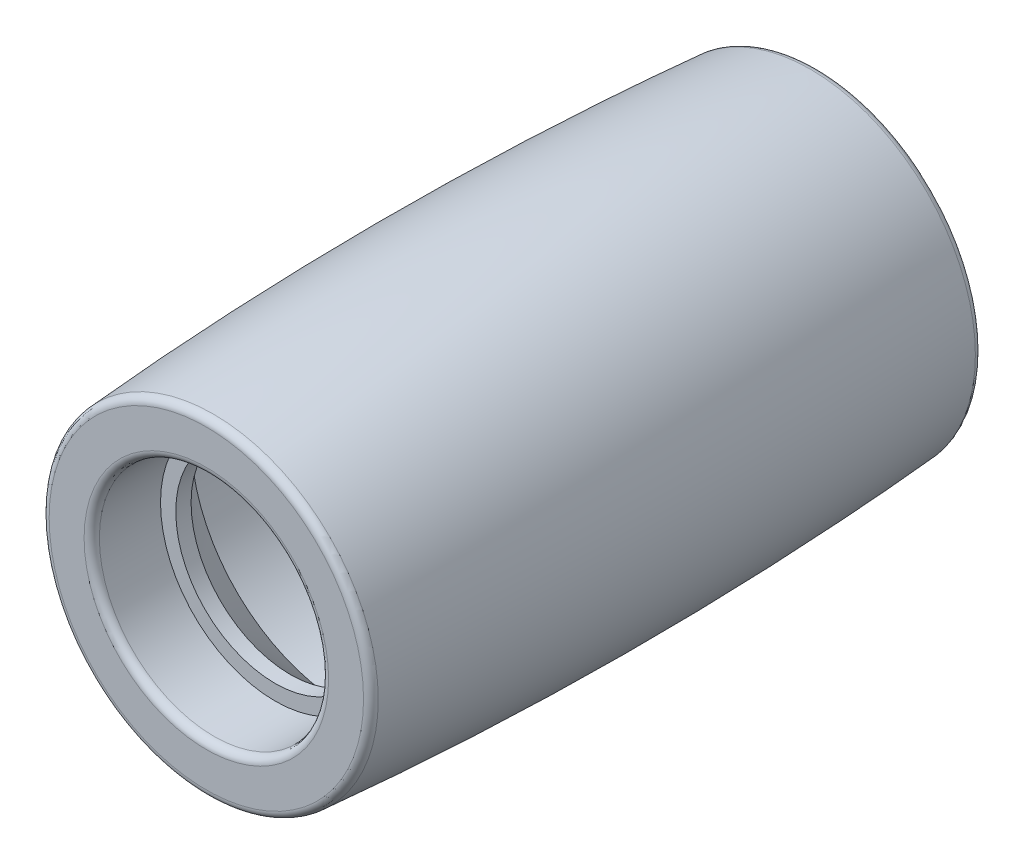
ISO-10303-21;
HEADER;
FILE_DESCRIPTION(('STEP AP214'),'2;1');
FILE_NAME('part.step','',(''),(''),'','','');
FILE_SCHEMA(('AUTOMOTIVE_DESIGN { 1 0 10303 214 1 1 1 1 }'));
ENDSEC;
DATA;
#1=APPLICATION_CONTEXT('core data for automotive mechanical design processes');
#2=APPLICATION_PROTOCOL_DEFINITION('international standard','automotive_design',2000,#1);
#3=PRODUCT_CONTEXT('',#1,'mechanical');
#4=PRODUCT('Part','Part','',(#3));
#5=PRODUCT_RELATED_PRODUCT_CATEGORY('part','',(#4));
#6=PRODUCT_DEFINITION_FORMATION('','',#4);
#7=PRODUCT_DEFINITION_CONTEXT('part definition',#1,'design');
#8=PRODUCT_DEFINITION('design','',#6,#7);
#9=PRODUCT_DEFINITION_SHAPE('','',#8);
#10=(LENGTH_UNIT() NAMED_UNIT(*) SI_UNIT(.MILLI.,.METRE.));
#11=(NAMED_UNIT(*) PLANE_ANGLE_UNIT() SI_UNIT($,.RADIAN.));
#12=(NAMED_UNIT(*) SI_UNIT($,.STERADIAN.) SOLID_ANGLE_UNIT());
#13=UNCERTAINTY_MEASURE_WITH_UNIT(LENGTH_MEASURE(1.E-05),#10,'distance_accuracy_value','');
#14=(GEOMETRIC_REPRESENTATION_CONTEXT(3) GLOBAL_UNCERTAINTY_ASSIGNED_CONTEXT((#13)) GLOBAL_UNIT_ASSIGNED_CONTEXT((#10,
#11,#12)) REPRESENTATION_CONTEXT('',''));
#15=CARTESIAN_POINT('',(0.,0.,0.));
#16=DIRECTION('',(0.,0.,1.));
#17=DIRECTION('',(1.,0.,0.));
#18=AXIS2_PLACEMENT_3D('',#15,#16,#17);
#19=CARTESIAN_POINT('',(450.,0.,-49.5));
#20=DIRECTION('',(0.,0.,1.));
#21=DIRECTION('',(1.,0.,0.));
#22=AXIS2_PLACEMENT_3D('',#19,#20,#21);
#23=DEGENERATE_TOROIDAL_SURFACE('',#22,511.083333333333,534.083333333333,.F.);
#24=CARTESIAN_POINT('',(450.,0.,-10.4268407065812));
#25=DIRECTION('',(0.,0.,-1.));
#26=DIRECTION('',(-1.,0.,0.));
#27=AXIS2_PLACEMENT_3D('',#24,#25,#26);
#28=CIRCLE('',#27,21.5688000213315);
#29=CARTESIAN_POINT('',(428.431199978669,0.,-10.4268407065812));
#30=VERTEX_POINT('',#29);
#31=EDGE_CURVE('E61',#30,#30,#28,.T.);
#32=ORIENTED_EDGE('',*,*,#31,.T.);
#33=EDGE_LOOP('',(#32));
#34=FACE_BOUND('',#33,.T.);
#35=CARTESIAN_POINT('',(450.,0.,-88.5731592934189));
#36=DIRECTION('',(0.,0.,1.));
#37=DIRECTION('',(1.,0.,0.));
#38=AXIS2_PLACEMENT_3D('',#35,#36,#37);
#39=CIRCLE('',#38,21.5688000213314);
#40=CARTESIAN_POINT('',(471.568800021331,0.,-88.5731592934189));
#41=VERTEX_POINT('',#40);
#42=EDGE_CURVE('E64',#41,#41,#39,.T.);
#43=ORIENTED_EDGE('',*,*,#42,.T.);
#44=EDGE_LOOP('',(#43));
#45=FACE_BOUND('',#44,.T.);
#46=ADVANCED_FACE('F41',(#34,#45),#23,.F.);
#47=CARTESIAN_POINT('',(450.,21.5,-9.49999999999999));
#48=DIRECTION('',(0.,0.,-1.));
#49=DIRECTION('',(-1.,0.,0.));
#50=AXIS2_PLACEMENT_3D('',#47,#48,#49);
#51=PLANE('',#50);
#52=CARTESIAN_POINT('',(450.,0.,-9.49999999999999));
#53=DIRECTION('',(0.,0.,-1.));
#54=DIRECTION('',(-1.,0.,0.));
#55=AXIS2_PLACEMENT_3D('',#52,#53,#54);
#56=CIRCLE('',#55,20.5714797529188);
#57=CARTESIAN_POINT('',(429.428520247081,0.,-9.49999999999999));
#58=VERTEX_POINT('',#57);
#59=EDGE_CURVE('E67',#58,#58,#56,.F.);
#60=ORIENTED_EDGE('',*,*,#59,.T.);
#61=EDGE_LOOP('',(#60));
#62=FACE_BOUND('',#61,.T.);
#63=CARTESIAN_POINT('',(450.,0.,-9.49999999999999));
#64=DIRECTION('',(0.,0.,-1.));
#65=DIRECTION('',(-1.,0.,0.));
#66=AXIS2_PLACEMENT_3D('',#63,#64,#65);
#67=CIRCLE('',#66,16.);
#68=CARTESIAN_POINT('',(434.,0.,-9.49999999999999));
#69=VERTEX_POINT('',#68);
#70=EDGE_CURVE('E70',#69,#69,#67,.T.);
#71=ORIENTED_EDGE('',*,*,#70,.T.);
#72=EDGE_LOOP('',(#71));
#73=FACE_BOUND('',#72,.T.);
#74=ADVANCED_FACE('F122',(#62,#73),#51,.F.);
#75=CARTESIAN_POINT('',(450.,0.,0.));
#76=DIRECTION('',(0.,0.,1.));
#77=DIRECTION('',(1.,0.,0.));
#78=AXIS2_PLACEMENT_3D('',#75,#76,#77);
#79=CYLINDRICAL_SURFACE('',#78,15.);
#80=CARTESIAN_POINT('',(450.,0.,-10.5));
#81=DIRECTION('',(0.,0.,-1.));
#82=DIRECTION('',(-1.,0.,0.));
#83=AXIS2_PLACEMENT_3D('',#80,#81,#82);
#84=CIRCLE('',#83,15.);
#85=CARTESIAN_POINT('',(435.,0.,-10.5));
#86=VERTEX_POINT('',#85);
#87=EDGE_CURVE('E56',#86,#86,#84,.F.);
#88=ORIENTED_EDGE('',*,*,#87,.T.);
#89=EDGE_LOOP('',(#88));
#90=FACE_BOUND('',#89,.T.);
#91=CARTESIAN_POINT('',(450.,0.,-18.5));
#92=DIRECTION('',(0.,0.,1.));
#93=DIRECTION('',(1.,0.,0.));
#94=AXIS2_PLACEMENT_3D('',#91,#92,#93);
#95=CIRCLE('',#94,15.);
#96=CARTESIAN_POINT('',(465.,0.,-18.5));
#97=VERTEX_POINT('',#96);
#98=EDGE_CURVE('E73',#97,#97,#95,.T.);
#99=ORIENTED_EDGE('',*,*,#98,.F.);
#100=EDGE_LOOP('',(#99));
#101=FACE_BOUND('',#100,.T.);
#102=ADVANCED_FACE('F127',(#90,#101),#79,.F.);
#103=CARTESIAN_POINT('',(450.,15.,-18.5));
#104=DIRECTION('',(0.,0.,-1.));
#105=DIRECTION('',(-1.,0.,0.));
#106=AXIS2_PLACEMENT_3D('',#103,#104,#105);
#107=PLANE('',#106);
#108=CARTESIAN_POINT('',(450.,0.,-18.5));
#109=DIRECTION('',(0.,0.,1.));
#110=DIRECTION('',(1.,0.,0.));
#111=AXIS2_PLACEMENT_3D('',#108,#109,#110);
#112=CIRCLE('',#111,13.);
#113=CARTESIAN_POINT('',(463.,0.,-18.5));
#114=VERTEX_POINT('',#113);
#115=EDGE_CURVE('E77',#114,#114,#112,.T.);
#116=ORIENTED_EDGE('',*,*,#115,.F.);
#117=EDGE_LOOP('',(#116));
#118=FACE_BOUND('',#117,.T.);
#119=ORIENTED_EDGE('',*,*,#98,.T.);
#120=EDGE_LOOP('',(#119));
#121=FACE_BOUND('',#120,.T.);
#122=ADVANCED_FACE('F242',(#118,#121),#107,.F.);
#123=CARTESIAN_POINT('',(450.,0.,0.));
#124=DIRECTION('',(0.,0.,1.));
#125=DIRECTION('',(1.,0.,0.));
#126=AXIS2_PLACEMENT_3D('',#123,#124,#125);
#127=CYLINDRICAL_SURFACE('',#126,13.);
#128=CARTESIAN_POINT('',(450.,0.,-20.5));
#129=DIRECTION('',(0.,0.,1.));
#130=DIRECTION('',(1.,0.,0.));
#131=AXIS2_PLACEMENT_3D('',#128,#129,#130);
#132=CIRCLE('',#131,13.);
#133=CARTESIAN_POINT('',(463.,0.,-20.5));
#134=VERTEX_POINT('',#133);
#135=EDGE_CURVE('E81',#134,#134,#132,.T.);
#136=ORIENTED_EDGE('',*,*,#135,.F.);
#137=EDGE_LOOP('',(#136));
#138=FACE_BOUND('',#137,.T.);
#139=ORIENTED_EDGE('',*,*,#115,.T.);
#140=EDGE_LOOP('',(#139));
#141=FACE_BOUND('',#140,.T.);
#142=ADVANCED_FACE('F118',(#138,#141),#127,.F.);
#143=CARTESIAN_POINT('',(450.,0.,-20.5));
#144=DIRECTION('',(0.,0.,-1.));
#145=DIRECTION('',(-1.,0.,0.));
#146=AXIS2_PLACEMENT_3D('',#143,#144,#145);
#147=CONICAL_SURFACE('',#146,13.,0.78539816339745);
#148=CARTESIAN_POINT('',(450.,0.,-27.712088496298));
#149=DIRECTION('',(0.,0.,1.));
#150=DIRECTION('',(1.,0.,0.));
#151=AXIS2_PLACEMENT_3D('',#148,#149,#150);
#152=CIRCLE('',#151,20.212088496298);
#153=CARTESIAN_POINT('',(470.212088496298,0.,-27.712088496298));
#154=VERTEX_POINT('',#153);
#155=EDGE_CURVE('E85',#154,#154,#152,.T.);
#156=ORIENTED_EDGE('',*,*,#155,.F.);
#157=EDGE_LOOP('',(#156));
#158=FACE_BOUND('',#157,.T.);
#159=ORIENTED_EDGE('',*,*,#135,.T.);
#160=EDGE_LOOP('',(#159));
#161=FACE_BOUND('',#160,.T.);
#162=ADVANCED_FACE('F107',(#158,#161),#147,.F.);
#163=CARTESIAN_POINT('',(450.,0.,0.));
#164=DIRECTION('',(0.,0.,1.));
#165=DIRECTION('',(1.,0.,0.));
#166=AXIS2_PLACEMENT_3D('',#163,#164,#165);
#167=CYLINDRICAL_SURFACE('',#166,20.212088496298);
#168=ORIENTED_EDGE('',*,*,#155,.T.);
#169=EDGE_LOOP('',(#168));
#170=FACE_BOUND('',#169,.T.);
#171=CARTESIAN_POINT('',(450.,0.,-71.2879115037021));
#172=DIRECTION('',(0.,0.,1.));
#173=DIRECTION('',(1.,0.,0.));
#174=AXIS2_PLACEMENT_3D('',#171,#172,#173);
#175=CIRCLE('',#174,20.212088496298);
#176=CARTESIAN_POINT('',(470.212088496298,0.,-71.2879115037021));
#177=VERTEX_POINT('',#176);
#178=EDGE_CURVE('E97',#177,#177,#175,.T.);
#179=ORIENTED_EDGE('',*,*,#178,.F.);
#180=EDGE_LOOP('',(#179));
#181=FACE_BOUND('',#180,.T.);
#182=ADVANCED_FACE('F104',(#170,#181),#167,.F.);
#183=CARTESIAN_POINT('',(450.,21.5,-89.5000000000001));
#184=DIRECTION('',(0.,0.,1.));
#185=DIRECTION('',(-1.,0.,0.));
#186=AXIS2_PLACEMENT_3D('',#183,#184,#185);
#187=PLANE('',#186);
#188=CARTESIAN_POINT('',(450.,0.,-89.5000000000001));
#189=DIRECTION('',(0.,0.,1.));
#190=DIRECTION('',(1.,0.,0.));
#191=AXIS2_PLACEMENT_3D('',#188,#189,#190);
#192=CIRCLE('',#191,20.5714797529188);
#193=CARTESIAN_POINT('',(470.571479752919,0.,-89.5000000000001));
#194=VERTEX_POINT('',#193);
#195=EDGE_CURVE('E48',#194,#194,#192,.F.);
#196=ORIENTED_EDGE('',*,*,#195,.T.);
#197=EDGE_LOOP('',(#196));
#198=FACE_BOUND('',#197,.T.);
#199=CARTESIAN_POINT('',(450.,0.,-89.5000000000001));
#200=DIRECTION('',(0.,0.,1.));
#201=DIRECTION('',(1.,0.,0.));
#202=AXIS2_PLACEMENT_3D('',#199,#200,#201);
#203=CIRCLE('',#202,16.);
#204=CARTESIAN_POINT('',(466.,0.,-89.5000000000001));
#205=VERTEX_POINT('',#204);
#206=EDGE_CURVE('E52',#205,#205,#203,.T.);
#207=ORIENTED_EDGE('',*,*,#206,.T.);
#208=EDGE_LOOP('',(#207));
#209=FACE_BOUND('',#208,.T.);
#210=ADVANCED_FACE('F106',(#198,#209),#187,.F.);
#211=CARTESIAN_POINT('',(450.,0.,-99.0000000000001));
#212=DIRECTION('',(0.,0.,-1.));
#213=DIRECTION('',(1.,0.,0.));
#214=AXIS2_PLACEMENT_3D('',#211,#212,#213);
#215=CYLINDRICAL_SURFACE('',#214,15.);
#216=CARTESIAN_POINT('',(450.,0.,-88.5000000000001));
#217=DIRECTION('',(0.,0.,1.));
#218=DIRECTION('',(1.,0.,0.));
#219=AXIS2_PLACEMENT_3D('',#216,#217,#218);
#220=CIRCLE('',#219,15.);
#221=CARTESIAN_POINT('',(465.,0.,-88.5000000000001));
#222=VERTEX_POINT('',#221);
#223=EDGE_CURVE('E10',#222,#222,#220,.F.);
#224=ORIENTED_EDGE('',*,*,#223,.T.);
#225=EDGE_LOOP('',(#224));
#226=FACE_BOUND('',#225,.T.);
#227=CARTESIAN_POINT('',(450.,0.,-80.5000000000001));
#228=DIRECTION('',(0.,0.,1.));
#229=DIRECTION('',(1.,0.,0.));
#230=AXIS2_PLACEMENT_3D('',#227,#228,#229);
#231=CIRCLE('',#230,15.);
#232=CARTESIAN_POINT('',(465.,0.,-80.5000000000001));
#233=VERTEX_POINT('',#232);
#234=EDGE_CURVE('E88',#233,#233,#231,.T.);
#235=ORIENTED_EDGE('',*,*,#234,.T.);
#236=EDGE_LOOP('',(#235));
#237=FACE_BOUND('',#236,.T.);
#238=ADVANCED_FACE('F115',(#226,#237),#215,.F.);
#239=CARTESIAN_POINT('',(450.,15.,-80.5000000000001));
#240=DIRECTION('',(0.,0.,1.));
#241=DIRECTION('',(-1.,0.,0.));
#242=AXIS2_PLACEMENT_3D('',#239,#240,#241);
#243=PLANE('',#242);
#244=CARTESIAN_POINT('',(450.,0.,-80.5000000000001));
#245=DIRECTION('',(0.,0.,1.));
#246=DIRECTION('',(1.,0.,0.));
#247=AXIS2_PLACEMENT_3D('',#244,#245,#246);
#248=CIRCLE('',#247,13.);
#249=CARTESIAN_POINT('',(463.,0.,-80.5000000000001));
#250=VERTEX_POINT('',#249);
#251=EDGE_CURVE('E91',#250,#250,#248,.T.);
#252=ORIENTED_EDGE('',*,*,#251,.T.);
#253=EDGE_LOOP('',(#252));
#254=FACE_BOUND('',#253,.T.);
#255=ORIENTED_EDGE('',*,*,#234,.F.);
#256=EDGE_LOOP('',(#255));
#257=FACE_BOUND('',#256,.T.);
#258=ADVANCED_FACE('F190',(#254,#257),#243,.F.);
#259=CARTESIAN_POINT('',(450.,0.,-99.0000000000001));
#260=DIRECTION('',(0.,0.,-1.));
#261=DIRECTION('',(1.,0.,0.));
#262=AXIS2_PLACEMENT_3D('',#259,#260,#261);
#263=CYLINDRICAL_SURFACE('',#262,13.);
#264=CARTESIAN_POINT('',(450.,0.,-78.5000000000001));
#265=DIRECTION('',(0.,0.,1.));
#266=DIRECTION('',(1.,0.,0.));
#267=AXIS2_PLACEMENT_3D('',#264,#265,#266);
#268=CIRCLE('',#267,13.);
#269=CARTESIAN_POINT('',(463.,0.,-78.5000000000001));
#270=VERTEX_POINT('',#269);
#271=EDGE_CURVE('E94',#270,#270,#268,.T.);
#272=ORIENTED_EDGE('',*,*,#271,.T.);
#273=EDGE_LOOP('',(#272));
#274=FACE_BOUND('',#273,.T.);
#275=ORIENTED_EDGE('',*,*,#251,.F.);
#276=EDGE_LOOP('',(#275));
#277=FACE_BOUND('',#276,.T.);
#278=ADVANCED_FACE('F181',(#274,#277),#263,.F.);
#279=CARTESIAN_POINT('',(450.,0.,-78.5000000000001));
#280=DIRECTION('',(0.,0.,1.));
#281=DIRECTION('',(-1.,0.,0.));
#282=AXIS2_PLACEMENT_3D('',#279,#280,#281);
#283=CONICAL_SURFACE('',#282,13.,0.78539816339745);
#284=ORIENTED_EDGE('',*,*,#178,.T.);
#285=EDGE_LOOP('',(#284));
#286=FACE_BOUND('',#285,.T.);
#287=ORIENTED_EDGE('',*,*,#271,.F.);
#288=EDGE_LOOP('',(#287));
#289=FACE_BOUND('',#288,.T.);
#290=ADVANCED_FACE('F101',(#286,#289),#283,.F.);
#291=CARTESIAN_POINT('',(450.,0.,-10.5));
#292=DIRECTION('',(0.,0.,-1.));
#293=DIRECTION('',(-1.,0.,0.));
#294=AXIS2_PLACEMENT_3D('',#291,#292,#293);
#295=TOROIDAL_SURFACE('',#294,20.5714797529188,1.);
#296=ORIENTED_EDGE('',*,*,#31,.F.);
#297=EDGE_LOOP('',(#296));
#298=FACE_BOUND('',#297,.T.);
#299=ORIENTED_EDGE('',*,*,#59,.F.);
#300=EDGE_LOOP('',(#299));
#301=FACE_BOUND('',#300,.T.);
#302=ADVANCED_FACE('F133',(#298,#301),#295,.T.);
#303=CARTESIAN_POINT('',(450.,0.,-10.5));
#304=DIRECTION('',(0.,0.,-1.));
#305=DIRECTION('',(-1.,0.,0.));
#306=AXIS2_PLACEMENT_3D('',#303,#304,#305);
#307=TOROIDAL_SURFACE('',#306,16.,1.);
#308=ORIENTED_EDGE('',*,*,#70,.F.);
#309=EDGE_LOOP('',(#308));
#310=FACE_BOUND('',#309,.T.);
#311=ORIENTED_EDGE('',*,*,#87,.F.);
#312=EDGE_LOOP('',(#311));
#313=FACE_BOUND('',#312,.T.);
#314=ADVANCED_FACE('F136',(#310,#313),#307,.T.);
#315=CARTESIAN_POINT('',(450.,0.,-88.5000000000001));
#316=DIRECTION('',(0.,0.,1.));
#317=DIRECTION('',(1.,0.,0.));
#318=AXIS2_PLACEMENT_3D('',#315,#316,#317);
#319=TOROIDAL_SURFACE('',#318,20.5714797529188,1.);
#320=ORIENTED_EDGE('',*,*,#195,.F.);
#321=EDGE_LOOP('',(#320));
#322=FACE_BOUND('',#321,.T.);
#323=ORIENTED_EDGE('',*,*,#42,.F.);
#324=EDGE_LOOP('',(#323));
#325=FACE_BOUND('',#324,.T.);
#326=ADVANCED_FACE('F139',(#322,#325),#319,.T.);
#327=CARTESIAN_POINT('',(450.,0.,-88.5000000000001));
#328=DIRECTION('',(0.,0.,1.));
#329=DIRECTION('',(1.,0.,0.));
#330=AXIS2_PLACEMENT_3D('',#327,#328,#329);
#331=TOROIDAL_SURFACE('',#330,16.,1.);
#332=ORIENTED_EDGE('',*,*,#223,.F.);
#333=EDGE_LOOP('',(#332));
#334=FACE_BOUND('',#333,.T.);
#335=ORIENTED_EDGE('',*,*,#206,.F.);
#336=EDGE_LOOP('',(#335));
#337=FACE_BOUND('',#336,.T.);
#338=ADVANCED_FACE('F43',(#334,#337),#331,.T.);
#339=CLOSED_SHELL('',(#46,#74,#102,#122,#142,#162,#182,#210,#238,#258,#278,#290,#302,#314,#326,#338));
#340=MANIFOLD_SOLID_BREP('B2',#339);
#341=ADVANCED_BREP_SHAPE_REPRESENTATION('',(#18,#340),#14);
#342=SHAPE_DEFINITION_REPRESENTATION(#9,#341);
ENDSEC;
END-ISO-10303-21;
